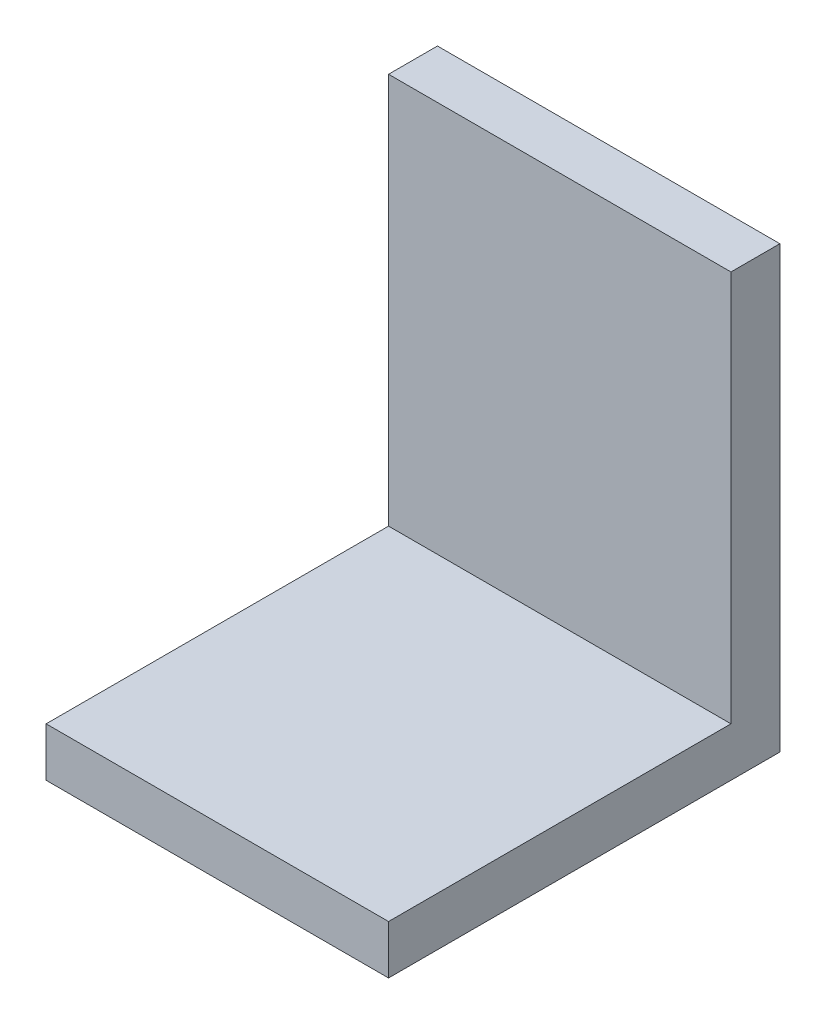
ISO-10303-21;
HEADER;
FILE_DESCRIPTION(('STEP AP214'),'2;1');
FILE_NAME('part.step','',(''),(''),'','','');
FILE_SCHEMA(('AUTOMOTIVE_DESIGN { 1 0 10303 214 1 1 1 1 }'));
ENDSEC;
DATA;
#1=APPLICATION_CONTEXT('core data for automotive mechanical design processes');
#2=APPLICATION_PROTOCOL_DEFINITION('international standard','automotive_design',2000,#1);
#3=PRODUCT_CONTEXT('',#1,'mechanical');
#4=PRODUCT('Part','Part','',(#3));
#5=PRODUCT_RELATED_PRODUCT_CATEGORY('part','',(#4));
#6=PRODUCT_DEFINITION_FORMATION('','',#4);
#7=PRODUCT_DEFINITION_CONTEXT('part definition',#1,'design');
#8=PRODUCT_DEFINITION('design','',#6,#7);
#9=PRODUCT_DEFINITION_SHAPE('','',#8);
#10=(LENGTH_UNIT() NAMED_UNIT(*) SI_UNIT(.MILLI.,.METRE.));
#11=(NAMED_UNIT(*) PLANE_ANGLE_UNIT() SI_UNIT($,.RADIAN.));
#12=(NAMED_UNIT(*) SI_UNIT($,.STERADIAN.) SOLID_ANGLE_UNIT());
#13=UNCERTAINTY_MEASURE_WITH_UNIT(LENGTH_MEASURE(1.E-05),#10,'distance_accuracy_value','');
#14=(GEOMETRIC_REPRESENTATION_CONTEXT(3) GLOBAL_UNCERTAINTY_ASSIGNED_CONTEXT((#13)) GLOBAL_UNIT_ASSIGNED_CONTEXT((#10,
#11,#12)) REPRESENTATION_CONTEXT('',''));
#15=CARTESIAN_POINT('',(0.,0.,0.));
#16=DIRECTION('',(0.,0.,1.));
#17=DIRECTION('',(1.,0.,0.));
#18=AXIS2_PLACEMENT_3D('',#15,#16,#17);
#19=CARTESIAN_POINT('',(0.,5.,0.));
#20=DIRECTION('',(0.,-1.,0.));
#21=DIRECTION('',(0.,0.,-1.));
#22=AXIS2_PLACEMENT_3D('',#19,#20,#21);
#23=PLANE('',#22);
#24=DIRECTION('',(1.,0.,0.));
#25=VECTOR('',#24,1.);
#26=CARTESIAN_POINT('',(12.2633043176761,5.,-35.));
#27=LINE('',#26,#25);
#28=CARTESIAN_POINT('',(12.2633043176761,5.,-35.));
#29=VERTEX_POINT('',#28);
#30=CARTESIAN_POINT('',(47.2633043176761,5.,-35.));
#31=VERTEX_POINT('',#30);
#32=EDGE_CURVE('E55',#29,#31,#27,.T.);
#33=ORIENTED_EDGE('',*,*,#32,.F.);
#34=DIRECTION('',(0.,0.,1.));
#35=VECTOR('',#34,1.);
#36=CARTESIAN_POINT('',(12.2633043176761,5.,0.));
#37=LINE('',#36,#35);
#38=CARTESIAN_POINT('',(12.2633043176761,5.,0.));
#39=VERTEX_POINT('',#38);
#40=EDGE_CURVE('E93',#29,#39,#37,.T.);
#41=ORIENTED_EDGE('',*,*,#40,.T.);
#42=DIRECTION('',(1.,0.,0.));
#43=VECTOR('',#42,1.);
#44=CARTESIAN_POINT('',(12.2633043176761,5.,0.));
#45=LINE('',#44,#43);
#46=CARTESIAN_POINT('',(47.2633043176761,5.,0.));
#47=VERTEX_POINT('',#46);
#48=EDGE_CURVE('E61',#39,#47,#45,.T.);
#49=ORIENTED_EDGE('',*,*,#48,.T.);
#50=DIRECTION('',(0.,0.,-1.));
#51=VECTOR('',#50,1.);
#52=CARTESIAN_POINT('',(47.2633043176761,5.,0.));
#53=LINE('',#52,#51);
#54=EDGE_CURVE('E105',#47,#31,#53,.T.);
#55=ORIENTED_EDGE('',*,*,#54,.T.);
#56=EDGE_LOOP('',(#33,#41,#49,#55));
#57=FACE_BOUND('',#56,.T.);
#58=ADVANCED_FACE('F39',(#57),#23,.F.);
#59=CARTESIAN_POINT('',(12.2633043176761,5.,0.));
#60=DIRECTION('',(1.,0.,0.));
#61=DIRECTION('',(0.,0.,-1.));
#62=AXIS2_PLACEMENT_3D('',#59,#60,#61);
#63=PLANE('',#62);
#64=DIRECTION('',(0.,0.,1.));
#65=VECTOR('',#64,1.);
#66=CARTESIAN_POINT('',(12.2633043176761,0.,0.));
#67=LINE('',#66,#65);
#68=CARTESIAN_POINT('',(12.2633043176761,0.,-40.));
#69=VERTEX_POINT('',#68);
#70=CARTESIAN_POINT('',(12.2633043176761,0.,0.));
#71=VERTEX_POINT('',#70);
#72=EDGE_CURVE('E100',#69,#71,#67,.T.);
#73=ORIENTED_EDGE('',*,*,#72,.T.);
#74=DIRECTION('',(0.,-1.,0.));
#75=VECTOR('',#74,1.);
#76=CARTESIAN_POINT('',(12.2633043176761,5.,0.));
#77=LINE('',#76,#75);
#78=EDGE_CURVE('E11',#39,#71,#77,.T.);
#79=ORIENTED_EDGE('',*,*,#78,.F.);
#80=ORIENTED_EDGE('',*,*,#40,.F.);
#81=DIRECTION('',(0.,-1.,0.));
#82=VECTOR('',#81,1.);
#83=CARTESIAN_POINT('',(12.2633043176761,45.,-35.));
#84=LINE('',#83,#82);
#85=CARTESIAN_POINT('',(12.2633043176761,45.,-35.));
#86=VERTEX_POINT('',#85);
#87=EDGE_CURVE('E110',#86,#29,#84,.T.);
#88=ORIENTED_EDGE('',*,*,#87,.F.);
#89=DIRECTION('',(0.,0.,1.));
#90=VECTOR('',#89,1.);
#91=CARTESIAN_POINT('',(12.2633043176761,45.,-40.));
#92=LINE('',#91,#90);
#93=CARTESIAN_POINT('',(12.2633043176761,45.,-40.));
#94=VERTEX_POINT('',#93);
#95=EDGE_CURVE('E103',#94,#86,#92,.T.);
#96=ORIENTED_EDGE('',*,*,#95,.F.);
#97=DIRECTION('',(0.,-1.,0.));
#98=VECTOR('',#97,1.);
#99=CARTESIAN_POINT('',(12.2633043176761,5.,-40.));
#100=LINE('',#99,#98);
#101=EDGE_CURVE('E85',#94,#69,#100,.T.);
#102=ORIENTED_EDGE('',*,*,#101,.T.);
#103=EDGE_LOOP('',(#73,#79,#80,#88,#96,#102));
#104=FACE_BOUND('',#103,.T.);
#105=ADVANCED_FACE('F41',(#104),#63,.F.);
#106=CARTESIAN_POINT('',(12.2633043176761,5.,0.));
#107=DIRECTION('',(0.,0.,-1.));
#108=DIRECTION('',(-1.,0.,0.));
#109=AXIS2_PLACEMENT_3D('',#106,#107,#108);
#110=PLANE('',#109);
#111=DIRECTION('',(1.,0.,0.));
#112=VECTOR('',#111,1.);
#113=CARTESIAN_POINT('',(12.2633043176761,0.,0.));
#114=LINE('',#113,#112);
#115=CARTESIAN_POINT('',(47.2633043176761,0.,0.));
#116=VERTEX_POINT('',#115);
#117=EDGE_CURVE('E108',#71,#116,#114,.T.);
#118=ORIENTED_EDGE('',*,*,#117,.T.);
#119=DIRECTION('',(0.,-1.,0.));
#120=VECTOR('',#119,1.);
#121=CARTESIAN_POINT('',(47.2633043176761,5.,0.));
#122=LINE('',#121,#120);
#123=EDGE_CURVE('E48',#47,#116,#122,.T.);
#124=ORIENTED_EDGE('',*,*,#123,.F.);
#125=ORIENTED_EDGE('',*,*,#48,.F.);
#126=ORIENTED_EDGE('',*,*,#78,.T.);
#127=EDGE_LOOP('',(#118,#124,#125,#126));
#128=FACE_BOUND('',#127,.T.);
#129=ADVANCED_FACE('F131',(#128),#110,.F.);
#130=CARTESIAN_POINT('',(47.2633043176761,5.,0.));
#131=DIRECTION('',(-1.,0.,0.));
#132=DIRECTION('',(0.,0.,1.));
#133=AXIS2_PLACEMENT_3D('',#130,#131,#132);
#134=PLANE('',#133);
#135=DIRECTION('',(0.,0.,-1.));
#136=VECTOR('',#135,1.);
#137=CARTESIAN_POINT('',(47.2633043176761,0.,0.));
#138=LINE('',#137,#136);
#139=CARTESIAN_POINT('',(47.2633043176761,0.,-40.));
#140=VERTEX_POINT('',#139);
#141=EDGE_CURVE('E94',#116,#140,#138,.T.);
#142=ORIENTED_EDGE('',*,*,#141,.T.);
#143=DIRECTION('',(0.,-1.,0.));
#144=VECTOR('',#143,1.);
#145=CARTESIAN_POINT('',(47.2633043176761,5.,-40.));
#146=LINE('',#145,#144);
#147=CARTESIAN_POINT('',(47.2633043176761,45.,-40.));
#148=VERTEX_POINT('',#147);
#149=EDGE_CURVE('E88',#148,#140,#146,.T.);
#150=ORIENTED_EDGE('',*,*,#149,.F.);
#151=DIRECTION('',(0.,0.,-1.));
#152=VECTOR('',#151,1.);
#153=CARTESIAN_POINT('',(47.2633043176761,45.,-40.));
#154=LINE('',#153,#152);
#155=CARTESIAN_POINT('',(47.2633043176761,45.,-35.));
#156=VERTEX_POINT('',#155);
#157=EDGE_CURVE('E148',#156,#148,#154,.T.);
#158=ORIENTED_EDGE('',*,*,#157,.F.);
#159=DIRECTION('',(0.,-1.,0.));
#160=VECTOR('',#159,1.);
#161=CARTESIAN_POINT('',(47.2633043176761,45.,-35.));
#162=LINE('',#161,#160);
#163=EDGE_CURVE('E116',#156,#31,#162,.T.);
#164=ORIENTED_EDGE('',*,*,#163,.T.);
#165=ORIENTED_EDGE('',*,*,#54,.F.);
#166=ORIENTED_EDGE('',*,*,#123,.T.);
#167=EDGE_LOOP('',(#142,#150,#158,#164,#165,#166));
#168=FACE_BOUND('',#167,.T.);
#169=ADVANCED_FACE('F128',(#168),#134,.F.);
#170=CARTESIAN_POINT('',(12.2633043176761,5.,-40.));
#171=DIRECTION('',(0.,0.,1.));
#172=DIRECTION('',(1.,0.,0.));
#173=AXIS2_PLACEMENT_3D('',#170,#171,#172);
#174=PLANE('',#173);
#175=DIRECTION('',(-1.,0.,0.));
#176=VECTOR('',#175,1.);
#177=CARTESIAN_POINT('',(12.2633043176761,0.,-40.));
#178=LINE('',#177,#176);
#179=EDGE_CURVE('E81',#140,#69,#178,.T.);
#180=ORIENTED_EDGE('',*,*,#179,.T.);
#181=ORIENTED_EDGE('',*,*,#101,.F.);
#182=DIRECTION('',(-1.,0.,0.));
#183=VECTOR('',#182,1.);
#184=CARTESIAN_POINT('',(12.2633043176761,45.,-40.));
#185=LINE('',#184,#183);
#186=EDGE_CURVE('E151',#148,#94,#185,.T.);
#187=ORIENTED_EDGE('',*,*,#186,.F.);
#188=ORIENTED_EDGE('',*,*,#149,.T.);
#189=EDGE_LOOP('',(#180,#181,#187,#188));
#190=FACE_BOUND('',#189,.T.);
#191=ADVANCED_FACE('F83',(#190),#174,.F.);
#192=CARTESIAN_POINT('',(0.,0.,0.));
#193=DIRECTION('',(0.,-1.,0.));
#194=DIRECTION('',(0.,0.,-1.));
#195=AXIS2_PLACEMENT_3D('',#192,#193,#194);
#196=PLANE('',#195);
#197=ORIENTED_EDGE('',*,*,#72,.F.);
#198=ORIENTED_EDGE('',*,*,#179,.F.);
#199=ORIENTED_EDGE('',*,*,#141,.F.);
#200=ORIENTED_EDGE('',*,*,#117,.F.);
#201=EDGE_LOOP('',(#197,#198,#199,#200));
#202=FACE_BOUND('',#201,.T.);
#203=ADVANCED_FACE('F107',(#202),#196,.T.);
#204=CARTESIAN_POINT('',(12.2633043176761,45.,-35.));
#205=DIRECTION('',(0.,0.,-1.));
#206=DIRECTION('',(-1.,0.,0.));
#207=AXIS2_PLACEMENT_3D('',#204,#205,#206);
#208=PLANE('',#207);
#209=ORIENTED_EDGE('',*,*,#32,.T.);
#210=ORIENTED_EDGE('',*,*,#163,.F.);
#211=DIRECTION('',(1.,0.,0.));
#212=VECTOR('',#211,1.);
#213=CARTESIAN_POINT('',(12.2633043176761,45.,-35.));
#214=LINE('',#213,#212);
#215=EDGE_CURVE('E141',#86,#156,#214,.T.);
#216=ORIENTED_EDGE('',*,*,#215,.F.);
#217=ORIENTED_EDGE('',*,*,#87,.T.);
#218=EDGE_LOOP('',(#209,#210,#216,#217));
#219=FACE_BOUND('',#218,.T.);
#220=ADVANCED_FACE('F137',(#219),#208,.F.);
#221=CARTESIAN_POINT('',(0.,45.,0.));
#222=DIRECTION('',(0.,1.,0.));
#223=DIRECTION('',(0.,0.,1.));
#224=AXIS2_PLACEMENT_3D('',#221,#222,#223);
#225=PLANE('',#224);
#226=ORIENTED_EDGE('',*,*,#95,.T.);
#227=ORIENTED_EDGE('',*,*,#215,.T.);
#228=ORIENTED_EDGE('',*,*,#157,.T.);
#229=ORIENTED_EDGE('',*,*,#186,.T.);
#230=EDGE_LOOP('',(#226,#227,#228,#229));
#231=FACE_BOUND('',#230,.T.);
#232=ADVANCED_FACE('F150',(#231),#225,.T.);
#233=CLOSED_SHELL('',(#58,#105,#129,#169,#191,#203,#220,#232));
#234=MANIFOLD_SOLID_BREP('B2',#233);
#235=ADVANCED_BREP_SHAPE_REPRESENTATION('',(#18,#234),#14);
#236=SHAPE_DEFINITION_REPRESENTATION(#9,#235);
ENDSEC;
END-ISO-10303-21;
